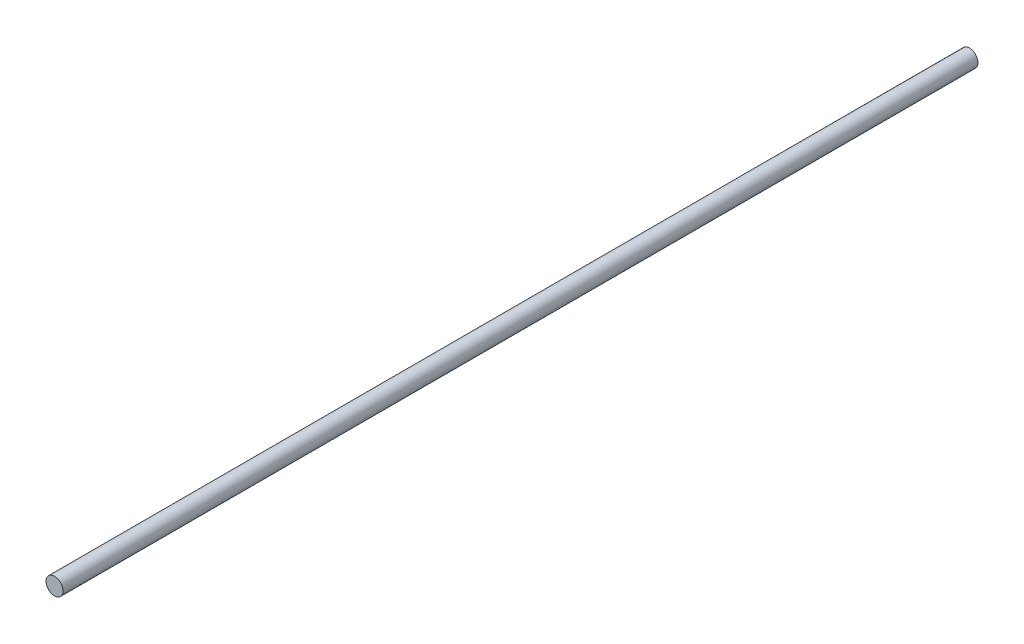
ISO-10303-21;
HEADER;
FILE_DESCRIPTION(('STEP AP214'),'2;1');
FILE_NAME('part.step','',(''),(''),'','','');
FILE_SCHEMA(('AUTOMOTIVE_DESIGN { 1 0 10303 214 1 1 1 1 }'));
ENDSEC;
DATA;
#1=APPLICATION_CONTEXT('core data for automotive mechanical design processes');
#2=APPLICATION_PROTOCOL_DEFINITION('international standard','automotive_design',2000,#1);
#3=PRODUCT_CONTEXT('',#1,'mechanical');
#4=PRODUCT('Part','Part','',(#3));
#5=PRODUCT_RELATED_PRODUCT_CATEGORY('part','',(#4));
#6=PRODUCT_DEFINITION_FORMATION('','',#4);
#7=PRODUCT_DEFINITION_CONTEXT('part definition',#1,'design');
#8=PRODUCT_DEFINITION('design','',#6,#7);
#9=PRODUCT_DEFINITION_SHAPE('','',#8);
#10=(LENGTH_UNIT() NAMED_UNIT(*) SI_UNIT(.MILLI.,.METRE.));
#11=(NAMED_UNIT(*) PLANE_ANGLE_UNIT() SI_UNIT($,.RADIAN.));
#12=(NAMED_UNIT(*) SI_UNIT($,.STERADIAN.) SOLID_ANGLE_UNIT());
#13=UNCERTAINTY_MEASURE_WITH_UNIT(LENGTH_MEASURE(1.E-05),#10,'distance_accuracy_value','');
#14=(GEOMETRIC_REPRESENTATION_CONTEXT(3) GLOBAL_UNCERTAINTY_ASSIGNED_CONTEXT((#13)) GLOBAL_UNIT_ASSIGNED_CONTEXT((#10,
#11,#12)) REPRESENTATION_CONTEXT('',''));
#15=CARTESIAN_POINT('',(0.,0.,0.));
#16=DIRECTION('',(0.,0.,1.));
#17=DIRECTION('',(1.,0.,0.));
#18=AXIS2_PLACEMENT_3D('',#15,#16,#17);
#19=CARTESIAN_POINT('',(0.,0.,430.));
#20=DIRECTION('',(0.,0.,-1.));
#21=DIRECTION('',(-1.,0.,0.));
#22=AXIS2_PLACEMENT_3D('',#19,#20,#21);
#23=CYLINDRICAL_SURFACE('',#22,4.);
#24=CARTESIAN_POINT('',(0.,0.,430.));
#25=DIRECTION('',(0.,0.,1.));
#26=DIRECTION('',(1.,0.,0.));
#27=AXIS2_PLACEMENT_3D('',#24,#25,#26);
#28=CIRCLE('',#27,4.);
#29=CARTESIAN_POINT('',(4.,0.,430.));
#30=VERTEX_POINT('',#29);
#31=EDGE_CURVE('E10',#30,#30,#28,.T.);
#32=ORIENTED_EDGE('',*,*,#31,.F.);
#33=EDGE_LOOP('',(#32));
#34=FACE_BOUND('',#33,.T.);
#35=CARTESIAN_POINT('',(0.,0.,0.));
#36=DIRECTION('',(0.,0.,1.));
#37=DIRECTION('',(1.,0.,0.));
#38=AXIS2_PLACEMENT_3D('',#35,#36,#37);
#39=CIRCLE('',#38,4.);
#40=CARTESIAN_POINT('',(4.,0.,0.));
#41=VERTEX_POINT('',#40);
#42=EDGE_CURVE('E34',#41,#41,#39,.T.);
#43=ORIENTED_EDGE('',*,*,#42,.T.);
#44=EDGE_LOOP('',(#43));
#45=FACE_BOUND('',#44,.T.);
#46=ADVANCED_FACE('F31',(#34,#45),#23,.T.);
#47=CARTESIAN_POINT('',(0.,0.,430.));
#48=DIRECTION('',(0.,0.,1.));
#49=DIRECTION('',(1.,0.,0.));
#50=AXIS2_PLACEMENT_3D('',#47,#48,#49);
#51=PLANE('',#50);
#52=ORIENTED_EDGE('',*,*,#31,.T.);
#53=EDGE_LOOP('',(#52));
#54=FACE_BOUND('',#53,.T.);
#55=ADVANCED_FACE('F46',(#54),#51,.T.);
#56=CARTESIAN_POINT('',(0.,0.,0.));
#57=DIRECTION('',(0.,0.,1.));
#58=DIRECTION('',(1.,0.,0.));
#59=AXIS2_PLACEMENT_3D('',#56,#57,#58);
#60=PLANE('',#59);
#61=ORIENTED_EDGE('',*,*,#42,.F.);
#62=EDGE_LOOP('',(#61));
#63=FACE_BOUND('',#62,.T.);
#64=ADVANCED_FACE('F44',(#63),#60,.F.);
#65=CLOSED_SHELL('',(#46,#55,#64));
#66=MANIFOLD_SOLID_BREP('B2',#65);
#67=ADVANCED_BREP_SHAPE_REPRESENTATION('',(#18,#66),#14);
#68=SHAPE_DEFINITION_REPRESENTATION(#9,#67);
ENDSEC;
END-ISO-10303-21;
